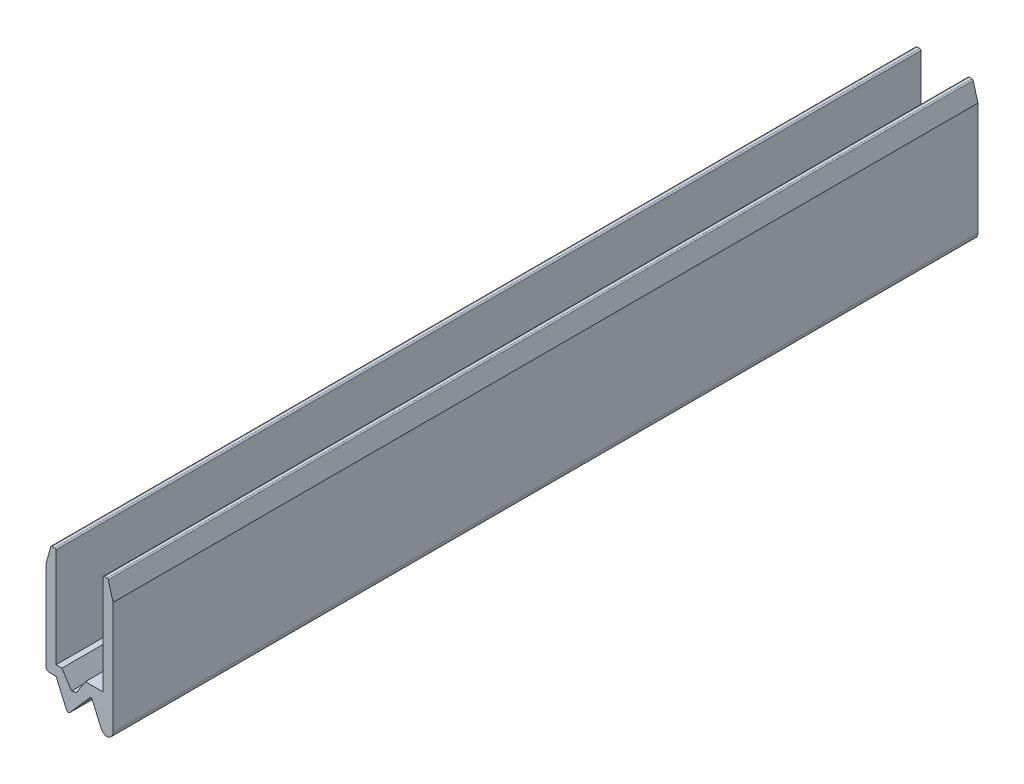
ISO-10303-21;
HEADER;
FILE_DESCRIPTION(('STEP AP214'),'2;1');
FILE_NAME('part.step','',(''),(''),'','','');
FILE_SCHEMA(('AUTOMOTIVE_DESIGN { 1 0 10303 214 1 1 1 1 }'));
ENDSEC;
DATA;
#1=APPLICATION_CONTEXT('core data for automotive mechanical design processes');
#2=APPLICATION_PROTOCOL_DEFINITION('international standard','automotive_design',2000,#1);
#3=PRODUCT_CONTEXT('',#1,'mechanical');
#4=PRODUCT('Part','Part','',(#3));
#5=PRODUCT_RELATED_PRODUCT_CATEGORY('part','',(#4));
#6=PRODUCT_DEFINITION_FORMATION('','',#4);
#7=PRODUCT_DEFINITION_CONTEXT('part definition',#1,'design');
#8=PRODUCT_DEFINITION('design','',#6,#7);
#9=PRODUCT_DEFINITION_SHAPE('','',#8);
#10=(LENGTH_UNIT() NAMED_UNIT(*) SI_UNIT(.MILLI.,.METRE.));
#11=(NAMED_UNIT(*) PLANE_ANGLE_UNIT() SI_UNIT($,.RADIAN.));
#12=(NAMED_UNIT(*) SI_UNIT($,.STERADIAN.) SOLID_ANGLE_UNIT());
#13=UNCERTAINTY_MEASURE_WITH_UNIT(LENGTH_MEASURE(1.E-05),#10,'distance_accuracy_value','');
#14=(GEOMETRIC_REPRESENTATION_CONTEXT(3) GLOBAL_UNCERTAINTY_ASSIGNED_CONTEXT((#13)) GLOBAL_UNIT_ASSIGNED_CONTEXT((#10,
#11,#12)) REPRESENTATION_CONTEXT('',''));
#15=CARTESIAN_POINT('',(0.,0.,0.));
#16=DIRECTION('',(0.,0.,1.));
#17=DIRECTION('',(1.,0.,0.));
#18=AXIS2_PLACEMENT_3D('',#15,#16,#17);
#19=CARTESIAN_POINT('',(9.25000000000002,20.5,129.));
#20=DIRECTION('',(-0.963517909629941,-0.267643863786094,0.));
#21=DIRECTION('',(0.267643863786094,-0.963517909629941,0.));
#22=AXIS2_PLACEMENT_3D('',#19,#20,#21);
#23=PLANE('',#22);
#24=DIRECTION('',(-0.267643863786094,0.963517909629941,0.));
#25=VECTOR('',#24,1.);
#26=CARTESIAN_POINT('',(9.25000000000002,20.5,0.));
#27=LINE('',#26,#25);
#28=CARTESIAN_POINT('',(10.,17.8,0.));
#29=VERTEX_POINT('',#28);
#30=CARTESIAN_POINT('',(9.2906864520119,20.3535287727572,0.));
#31=VERTEX_POINT('',#30);
#32=EDGE_CURVE('E295',#29,#31,#27,.T.);
#33=ORIENTED_EDGE('',*,*,#32,.T.);
#34=DIRECTION('',(0.,0.,-1.));
#35=VECTOR('',#34,1.);
#36=CARTESIAN_POINT('',(9.2906864520119,20.3535287727572,129.));
#37=LINE('',#36,#35);
#38=CARTESIAN_POINT('',(9.2906864520119,20.3535287727572,129.));
#39=VERTEX_POINT('',#38);
#40=EDGE_CURVE('E443',#31,#39,#37,.F.);
#41=ORIENTED_EDGE('',*,*,#40,.T.);
#42=DIRECTION('',(-0.267643863786094,0.963517909629941,0.));
#43=VECTOR('',#42,1.);
#44=CARTESIAN_POINT('',(9.25000000000002,20.5,129.));
#45=LINE('',#44,#43);
#46=CARTESIAN_POINT('',(10.,17.8,129.));
#47=VERTEX_POINT('',#46);
#48=EDGE_CURVE('E351',#47,#39,#45,.T.);
#49=ORIENTED_EDGE('',*,*,#48,.F.);
#50=DIRECTION('',(0.,0.,-1.));
#51=VECTOR('',#50,1.);
#52=CARTESIAN_POINT('',(10.,17.8,129.));
#53=LINE('',#52,#51);
#54=EDGE_CURVE('E294',#47,#29,#53,.T.);
#55=ORIENTED_EDGE('',*,*,#54,.T.);
#56=EDGE_LOOP('',(#33,#41,#49,#55));
#57=FACE_BOUND('',#56,.T.);
#58=ADVANCED_FACE('F46',(#57),#23,.F.);
#59=CARTESIAN_POINT('',(8.5,20.5,129.));
#60=DIRECTION('',(0.,-1.,0.));
#61=DIRECTION('',(1.,0.,0.));
#62=AXIS2_PLACEMENT_3D('',#59,#60,#61);
#63=PLANE('',#62);
#64=DIRECTION('',(-1.,0.,0.));
#65=VECTOR('',#64,1.);
#66=CARTESIAN_POINT('',(8.5,20.5,0.));
#67=LINE('',#66,#65);
#68=CARTESIAN_POINT('',(9.09798287008592,20.5,0.));
#69=VERTEX_POINT('',#68);
#70=CARTESIAN_POINT('',(8.7,20.5,0.));
#71=VERTEX_POINT('',#70);
#72=EDGE_CURVE('E299',#69,#71,#67,.T.);
#73=ORIENTED_EDGE('',*,*,#72,.T.);
#74=DIRECTION('',(0.,0.,-1.));
#75=VECTOR('',#74,1.);
#76=CARTESIAN_POINT('',(8.7,20.5,129.));
#77=LINE('',#76,#75);
#78=CARTESIAN_POINT('',(8.7,20.5,129.));
#79=VERTEX_POINT('',#78);
#80=EDGE_CURVE('E440',#71,#79,#77,.F.);
#81=ORIENTED_EDGE('',*,*,#80,.T.);
#82=DIRECTION('',(-1.,0.,0.));
#83=VECTOR('',#82,1.);
#84=CARTESIAN_POINT('',(8.5,20.5,129.));
#85=LINE('',#84,#83);
#86=CARTESIAN_POINT('',(9.09798287008592,20.5,129.));
#87=VERTEX_POINT('',#86);
#88=EDGE_CURVE('E234',#87,#79,#85,.T.);
#89=ORIENTED_EDGE('',*,*,#88,.F.);
#90=DIRECTION('',(0.,0.,-1.));
#91=VECTOR('',#90,1.);
#92=CARTESIAN_POINT('',(9.09798287008592,20.5,129.));
#93=LINE('',#92,#91);
#94=EDGE_CURVE('E436',#87,#69,#93,.T.);
#95=ORIENTED_EDGE('',*,*,#94,.T.);
#96=EDGE_LOOP('',(#73,#81,#89,#95));
#97=FACE_BOUND('',#96,.T.);
#98=ADVANCED_FACE('F597',(#97),#63,.F.);
#99=CARTESIAN_POINT('',(8.5,5.5,129.));
#100=DIRECTION('',(1.,0.,0.));
#101=DIRECTION('',(0.,0.,-1.));
#102=AXIS2_PLACEMENT_3D('',#99,#100,#101);
#103=PLANE('',#102);
#104=DIRECTION('',(0.,-1.,0.));
#105=VECTOR('',#104,1.);
#106=CARTESIAN_POINT('',(8.5,5.5,129.));
#107=LINE('',#106,#105);
#108=CARTESIAN_POINT('',(8.5,20.3,129.));
#109=VERTEX_POINT('',#108);
#110=CARTESIAN_POINT('',(8.5,5.5,129.));
#111=VERTEX_POINT('',#110);
#112=EDGE_CURVE('E220',#109,#111,#107,.T.);
#113=ORIENTED_EDGE('',*,*,#112,.F.);
#114=DIRECTION('',(0.,0.,-1.));
#115=VECTOR('',#114,1.);
#116=CARTESIAN_POINT('',(8.5,20.3,129.));
#117=LINE('',#116,#115);
#118=CARTESIAN_POINT('',(8.5,20.3,0.));
#119=VERTEX_POINT('',#118);
#120=EDGE_CURVE('E433',#109,#119,#117,.T.);
#121=ORIENTED_EDGE('',*,*,#120,.T.);
#122=DIRECTION('',(0.,-1.,0.));
#123=VECTOR('',#122,1.);
#124=CARTESIAN_POINT('',(8.5,5.5,0.));
#125=LINE('',#124,#123);
#126=CARTESIAN_POINT('',(8.5,5.5,0.));
#127=VERTEX_POINT('',#126);
#128=EDGE_CURVE('E240',#119,#127,#125,.T.);
#129=ORIENTED_EDGE('',*,*,#128,.T.);
#130=DIRECTION('',(0.,0.,-1.));
#131=VECTOR('',#130,1.);
#132=CARTESIAN_POINT('',(8.5,5.5,129.));
#133=LINE('',#132,#131);
#134=EDGE_CURVE('E237',#111,#127,#133,.T.);
#135=ORIENTED_EDGE('',*,*,#134,.F.);
#136=EDGE_LOOP('',(#113,#121,#129,#135));
#137=FACE_BOUND('',#136,.T.);
#138=ADVANCED_FACE('F238',(#137),#103,.F.);
#139=CARTESIAN_POINT('',(5.875,5.5,129.));
#140=DIRECTION('',(0.,-1.,0.));
#141=DIRECTION('',(0.,0.,-1.));
#142=AXIS2_PLACEMENT_3D('',#139,#140,#141);
#143=PLANE('',#142);
#144=DIRECTION('',(-1.,0.,0.));
#145=VECTOR('',#144,1.);
#146=CARTESIAN_POINT('',(5.875,5.5,0.));
#147=LINE('',#146,#145);
#148=CARTESIAN_POINT('',(5.875,5.5,0.));
#149=VERTEX_POINT('',#148);
#150=EDGE_CURVE('E306',#127,#149,#147,.T.);
#151=ORIENTED_EDGE('',*,*,#150,.T.);
#152=DIRECTION('',(0.,0.,-1.));
#153=VECTOR('',#152,1.);
#154=CARTESIAN_POINT('',(5.875,5.5,129.));
#155=LINE('',#154,#153);
#156=CARTESIAN_POINT('',(5.875,5.5,129.));
#157=VERTEX_POINT('',#156);
#158=EDGE_CURVE('E245',#157,#149,#155,.T.);
#159=ORIENTED_EDGE('',*,*,#158,.F.);
#160=DIRECTION('',(-1.,0.,0.));
#161=VECTOR('',#160,1.);
#162=CARTESIAN_POINT('',(5.875,5.5,129.));
#163=LINE('',#162,#161);
#164=EDGE_CURVE('E225',#111,#157,#163,.T.);
#165=ORIENTED_EDGE('',*,*,#164,.F.);
#166=ORIENTED_EDGE('',*,*,#134,.T.);
#167=EDGE_LOOP('',(#151,#159,#165,#166));
#168=FACE_BOUND('',#167,.T.);
#169=ADVANCED_FACE('F247',(#168),#143,.F.);
#170=CARTESIAN_POINT('',(5.875,5.5,129.));
#171=DIRECTION('',(0.843661487732107,-0.53687549219316,0.));
#172=DIRECTION('',(0.53687549219316,0.843661487732107,0.));
#173=AXIS2_PLACEMENT_3D('',#170,#171,#172);
#174=PLANE('',#173);
#175=DIRECTION('',(-0.53687549219316,-0.843661487732107,0.));
#176=VECTOR('',#175,1.);
#177=CARTESIAN_POINT('',(5.875,5.5,0.));
#178=LINE('',#177,#176);
#179=CARTESIAN_POINT('',(4.55450039375452,3.42492919018568,0.));
#180=VERTEX_POINT('',#179);
#181=EDGE_CURVE('E309',#149,#180,#178,.T.);
#182=ORIENTED_EDGE('',*,*,#181,.T.);
#183=DIRECTION('',(0.,0.,1.));
#184=VECTOR('',#183,1.);
#185=CARTESIAN_POINT('',(4.55450039375452,3.42492919018568,129.));
#186=LINE('',#185,#184);
#187=CARTESIAN_POINT('',(4.55450039375452,3.42492919018568,129.));
#188=VERTEX_POINT('',#187);
#189=EDGE_CURVE('E63',#180,#188,#186,.T.);
#190=ORIENTED_EDGE('',*,*,#189,.T.);
#191=DIRECTION('',(-0.53687549219316,-0.843661487732107,0.));
#192=VECTOR('',#191,1.);
#193=CARTESIAN_POINT('',(5.875,5.5,129.));
#194=LINE('',#193,#192);
#195=EDGE_CURVE('E250',#157,#188,#194,.T.);
#196=ORIENTED_EDGE('',*,*,#195,.F.);
#197=ORIENTED_EDGE('',*,*,#158,.T.);
#198=EDGE_LOOP('',(#182,#190,#196,#197));
#199=FACE_BOUND('',#198,.T.);
#200=ADVANCED_FACE('F591',(#199),#174,.F.);
#201=CARTESIAN_POINT('',(4.125,2.75,129.));
#202=DIRECTION('',(-0.843661487732108,-0.536875492193159,0.));
#203=DIRECTION('',(0.536875492193159,-0.843661487732108,0.));
#204=AXIS2_PLACEMENT_3D('',#201,#202,#203);
#205=PLANE('',#204);
#206=DIRECTION('',(-0.536875492193159,0.843661487732107,0.));
#207=VECTOR('',#206,1.);
#208=CARTESIAN_POINT('',(4.125,2.75,129.));
#209=LINE('',#208,#207);
#210=CARTESIAN_POINT('',(3.80192448257403,3.25769009881224,129.));
#211=VERTEX_POINT('',#210);
#212=CARTESIAN_POINT('',(2.375,5.5,129.));
#213=VERTEX_POINT('',#212);
#214=EDGE_CURVE('E253',#211,#213,#209,.T.);
#215=ORIENTED_EDGE('',*,*,#214,.F.);
#216=DIRECTION('',(0.,0.,-1.));
#217=VECTOR('',#216,1.);
#218=CARTESIAN_POINT('',(3.80192448257403,3.25769009881224,0.));
#219=LINE('',#218,#217);
#220=CARTESIAN_POINT('',(3.80192448257403,3.25769009881224,0.));
#221=VERTEX_POINT('',#220);
#222=EDGE_CURVE('E480',#211,#221,#219,.T.);
#223=ORIENTED_EDGE('',*,*,#222,.T.);
#224=DIRECTION('',(-0.536875492193159,0.843661487732107,0.));
#225=VECTOR('',#224,1.);
#226=CARTESIAN_POINT('',(4.125,2.75,0.));
#227=LINE('',#226,#225);
#228=CARTESIAN_POINT('',(2.375,5.5,0.));
#229=VERTEX_POINT('',#228);
#230=EDGE_CURVE('E312',#221,#229,#227,.T.);
#231=ORIENTED_EDGE('',*,*,#230,.T.);
#232=DIRECTION('',(0.,0.,-1.));
#233=VECTOR('',#232,1.);
#234=CARTESIAN_POINT('',(2.375,5.5,129.));
#235=LINE('',#234,#233);
#236=EDGE_CURVE('E367',#213,#229,#235,.T.);
#237=ORIENTED_EDGE('',*,*,#236,.F.);
#238=EDGE_LOOP('',(#215,#223,#231,#237));
#239=FACE_BOUND('',#238,.T.);
#240=ADVANCED_FACE('F492',(#239),#205,.F.);
#241=CARTESIAN_POINT('',(1.5,5.5,129.));
#242=DIRECTION('',(0.,-1.,0.));
#243=DIRECTION('',(1.,0.,0.));
#244=AXIS2_PLACEMENT_3D('',#241,#242,#243);
#245=PLANE('',#244);
#246=DIRECTION('',(-1.,0.,0.));
#247=VECTOR('',#246,1.);
#248=CARTESIAN_POINT('',(1.5,5.5,0.));
#249=LINE('',#248,#247);
#250=CARTESIAN_POINT('',(1.5,5.5,0.));
#251=VERTEX_POINT('',#250);
#252=EDGE_CURVE('E315',#229,#251,#249,.T.);
#253=ORIENTED_EDGE('',*,*,#252,.T.);
#254=DIRECTION('',(0.,0.,-1.));
#255=VECTOR('',#254,1.);
#256=CARTESIAN_POINT('',(1.5,5.5,129.));
#257=LINE('',#256,#255);
#258=CARTESIAN_POINT('',(1.5,5.5,129.));
#259=VERTEX_POINT('',#258);
#260=EDGE_CURVE('E363',#259,#251,#257,.T.);
#261=ORIENTED_EDGE('',*,*,#260,.F.);
#262=DIRECTION('',(-1.,0.,0.));
#263=VECTOR('',#262,1.);
#264=CARTESIAN_POINT('',(1.5,5.5,129.));
#265=LINE('',#264,#263);
#266=EDGE_CURVE('E259',#213,#259,#265,.T.);
#267=ORIENTED_EDGE('',*,*,#266,.F.);
#268=ORIENTED_EDGE('',*,*,#236,.T.);
#269=EDGE_LOOP('',(#253,#261,#267,#268));
#270=FACE_BOUND('',#269,.T.);
#271=ADVANCED_FACE('F502',(#270),#245,.F.);
#272=CARTESIAN_POINT('',(1.5,20.5,129.));
#273=DIRECTION('',(-1.,0.,0.));
#274=DIRECTION('',(0.,-1.,0.));
#275=AXIS2_PLACEMENT_3D('',#272,#273,#274);
#276=PLANE('',#275);
#277=DIRECTION('',(0.,1.,0.));
#278=VECTOR('',#277,1.);
#279=CARTESIAN_POINT('',(1.5,20.5,0.));
#280=LINE('',#279,#278);
#281=CARTESIAN_POINT('',(1.5,20.3,0.));
#282=VERTEX_POINT('',#281);
#283=EDGE_CURVE('E318',#251,#282,#280,.T.);
#284=ORIENTED_EDGE('',*,*,#283,.T.);
#285=DIRECTION('',(0.,0.,-1.));
#286=VECTOR('',#285,1.);
#287=CARTESIAN_POINT('',(1.5,20.3,129.));
#288=LINE('',#287,#286);
#289=CARTESIAN_POINT('',(1.5,20.3,129.));
#290=VERTEX_POINT('',#289);
#291=EDGE_CURVE('E430',#282,#290,#288,.F.);
#292=ORIENTED_EDGE('',*,*,#291,.T.);
#293=DIRECTION('',(0.,1.,0.));
#294=VECTOR('',#293,1.);
#295=CARTESIAN_POINT('',(1.5,20.5,129.));
#296=LINE('',#295,#294);
#297=EDGE_CURVE('E262',#259,#290,#296,.T.);
#298=ORIENTED_EDGE('',*,*,#297,.F.);
#299=ORIENTED_EDGE('',*,*,#260,.T.);
#300=EDGE_LOOP('',(#284,#292,#298,#299));
#301=FACE_BOUND('',#300,.T.);
#302=ADVANCED_FACE('F506',(#301),#276,.F.);
#303=CARTESIAN_POINT('',(0.75,20.5,129.));
#304=DIRECTION('',(0.,-1.,0.));
#305=DIRECTION('',(0.,0.,-1.));
#306=AXIS2_PLACEMENT_3D('',#303,#304,#305);
#307=PLANE('',#306);
#308=DIRECTION('',(-1.,0.,0.));
#309=VECTOR('',#308,1.);
#310=CARTESIAN_POINT('',(0.75,20.5,0.));
#311=LINE('',#310,#309);
#312=CARTESIAN_POINT('',(1.3,20.5,0.));
#313=VERTEX_POINT('',#312);
#314=CARTESIAN_POINT('',(0.902017129914105,20.5,0.));
#315=VERTEX_POINT('',#314);
#316=EDGE_CURVE('E322',#313,#315,#311,.T.);
#317=ORIENTED_EDGE('',*,*,#316,.T.);
#318=DIRECTION('',(0.,0.,-1.));
#319=VECTOR('',#318,1.);
#320=CARTESIAN_POINT('',(0.902017129914105,20.5,129.));
#321=LINE('',#320,#319);
#322=CARTESIAN_POINT('',(0.902017129914105,20.5,129.));
#323=VERTEX_POINT('',#322);
#324=EDGE_CURVE('E404',#315,#323,#321,.F.);
#325=ORIENTED_EDGE('',*,*,#324,.T.);
#326=DIRECTION('',(-1.,0.,0.));
#327=VECTOR('',#326,1.);
#328=CARTESIAN_POINT('',(0.75,20.5,129.));
#329=LINE('',#328,#327);
#330=CARTESIAN_POINT('',(1.3,20.5,129.));
#331=VERTEX_POINT('',#330);
#332=EDGE_CURVE('E266',#331,#323,#329,.T.);
#333=ORIENTED_EDGE('',*,*,#332,.F.);
#334=DIRECTION('',(0.,0.,-1.));
#335=VECTOR('',#334,1.);
#336=CARTESIAN_POINT('',(1.3,20.5,129.));
#337=LINE('',#336,#335);
#338=EDGE_CURVE('E400',#331,#313,#337,.T.);
#339=ORIENTED_EDGE('',*,*,#338,.T.);
#340=EDGE_LOOP('',(#317,#325,#333,#339));
#341=FACE_BOUND('',#340,.T.);
#342=ADVANCED_FACE('F515',(#341),#307,.F.);
#343=CARTESIAN_POINT('',(0.75,20.5,129.));
#344=DIRECTION('',(0.963517909629941,-0.267643863786095,0.));
#345=DIRECTION('',(0.267643863786095,0.963517909629941,0.));
#346=AXIS2_PLACEMENT_3D('',#343,#344,#345);
#347=PLANE('',#346);
#348=DIRECTION('',(-0.267643863786095,-0.963517909629941,0.));
#349=VECTOR('',#348,1.);
#350=CARTESIAN_POINT('',(0.75,20.5,129.));
#351=LINE('',#350,#349);
#352=CARTESIAN_POINT('',(0.709313547988117,20.3535287727572,129.));
#353=VERTEX_POINT('',#352);
#354=CARTESIAN_POINT('',(0.,17.8,129.));
#355=VERTEX_POINT('',#354);
#356=EDGE_CURVE('E269',#353,#355,#351,.T.);
#357=ORIENTED_EDGE('',*,*,#356,.F.);
#358=DIRECTION('',(0.,0.,-1.));
#359=VECTOR('',#358,1.);
#360=CARTESIAN_POINT('',(0.709313547988117,20.3535287727572,129.));
#361=LINE('',#360,#359);
#362=CARTESIAN_POINT('',(0.709313547988117,20.3535287727572,0.));
#363=VERTEX_POINT('',#362);
#364=EDGE_CURVE('E244',#353,#363,#361,.T.);
#365=ORIENTED_EDGE('',*,*,#364,.T.);
#366=DIRECTION('',(-0.267643863786095,-0.963517909629941,0.));
#367=VECTOR('',#366,1.);
#368=CARTESIAN_POINT('',(0.75,20.5,0.));
#369=LINE('',#368,#367);
#370=CARTESIAN_POINT('',(0.,17.8,0.));
#371=VERTEX_POINT('',#370);
#372=EDGE_CURVE('E326',#363,#371,#369,.T.);
#373=ORIENTED_EDGE('',*,*,#372,.T.);
#374=DIRECTION('',(0.,0.,-1.));
#375=VECTOR('',#374,1.);
#376=CARTESIAN_POINT('',(0.,17.8,129.));
#377=LINE('',#376,#375);
#378=EDGE_CURVE('E359',#355,#371,#377,.T.);
#379=ORIENTED_EDGE('',*,*,#378,.F.);
#380=EDGE_LOOP('',(#357,#365,#373,#379));
#381=FACE_BOUND('',#380,.T.);
#382=ADVANCED_FACE('F524',(#381),#347,.F.);
#383=CARTESIAN_POINT('',(0.,4.,129.));
#384=DIRECTION('',(1.,0.,0.));
#385=DIRECTION('',(0.,0.,-1.));
#386=AXIS2_PLACEMENT_3D('',#383,#384,#385);
#387=PLANE('',#386);
#388=DIRECTION('',(0.,-1.,0.));
#389=VECTOR('',#388,1.);
#390=CARTESIAN_POINT('',(0.,4.,0.));
#391=LINE('',#390,#389);
#392=CARTESIAN_POINT('',(0.,4.5,0.));
#393=VERTEX_POINT('',#392);
#394=EDGE_CURVE('E329',#371,#393,#391,.T.);
#395=ORIENTED_EDGE('',*,*,#394,.T.);
#396=DIRECTION('',(0.,0.,-1.));
#397=VECTOR('',#396,1.);
#398=CARTESIAN_POINT('',(0.,4.5,129.));
#399=LINE('',#398,#397);
#400=CARTESIAN_POINT('',(0.,4.5,129.));
#401=VERTEX_POINT('',#400);
#402=EDGE_CURVE('E464',#393,#401,#399,.F.);
#403=ORIENTED_EDGE('',*,*,#402,.T.);
#404=DIRECTION('',(0.,-1.,0.));
#405=VECTOR('',#404,1.);
#406=CARTESIAN_POINT('',(0.,4.,129.));
#407=LINE('',#406,#405);
#408=EDGE_CURVE('E272',#355,#401,#407,.T.);
#409=ORIENTED_EDGE('',*,*,#408,.F.);
#410=ORIENTED_EDGE('',*,*,#378,.T.);
#411=EDGE_LOOP('',(#395,#403,#409,#410));
#412=FACE_BOUND('',#411,.T.);
#413=ADVANCED_FACE('F768',(#412),#387,.F.);
#414=CARTESIAN_POINT('',(1.5,4.,129.));
#415=DIRECTION('',(0.,1.,0.));
#416=DIRECTION('',(0.,0.,1.));
#417=AXIS2_PLACEMENT_3D('',#414,#415,#416);
#418=PLANE('',#417);
#419=DIRECTION('',(1.,0.,0.));
#420=VECTOR('',#419,1.);
#421=CARTESIAN_POINT('',(1.5,4.,129.));
#422=LINE('',#421,#420);
#423=CARTESIAN_POINT('',(0.5,4.,129.));
#424=VERTEX_POINT('',#423);
#425=CARTESIAN_POINT('',(1.5,4.,129.));
#426=VERTEX_POINT('',#425);
#427=EDGE_CURVE('E276',#424,#426,#422,.T.);
#428=ORIENTED_EDGE('',*,*,#427,.F.);
#429=DIRECTION('',(0.,0.,-1.));
#430=VECTOR('',#429,1.);
#431=CARTESIAN_POINT('',(0.5,4.,129.));
#432=LINE('',#431,#430);
#433=CARTESIAN_POINT('',(0.5,4.,0.));
#434=VERTEX_POINT('',#433);
#435=EDGE_CURVE('E460',#424,#434,#432,.T.);
#436=ORIENTED_EDGE('',*,*,#435,.T.);
#437=DIRECTION('',(1.,0.,0.));
#438=VECTOR('',#437,1.);
#439=CARTESIAN_POINT('',(1.5,4.,0.));
#440=LINE('',#439,#438);
#441=CARTESIAN_POINT('',(1.5,4.,0.));
#442=VERTEX_POINT('',#441);
#443=EDGE_CURVE('E333',#434,#442,#440,.T.);
#444=ORIENTED_EDGE('',*,*,#443,.T.);
#445=DIRECTION('',(0.,0.,-1.));
#446=VECTOR('',#445,1.);
#447=CARTESIAN_POINT('',(1.5,4.,129.));
#448=LINE('',#447,#446);
#449=EDGE_CURVE('E355',#426,#442,#448,.T.);
#450=ORIENTED_EDGE('',*,*,#449,.F.);
#451=EDGE_LOOP('',(#428,#436,#444,#450));
#452=FACE_BOUND('',#451,.T.);
#453=ADVANCED_FACE('F536',(#452),#418,.F.);
#454=CARTESIAN_POINT('',(3.25,0.,129.));
#455=DIRECTION('',(0.916157334902189,0.400818834019708,0.));
#456=DIRECTION('',(-0.400818834019708,0.916157334902189,0.));
#457=AXIS2_PLACEMENT_3D('',#454,#455,#456);
#458=PLANE('',#457);
#459=DIRECTION('',(0.400818834019708,-0.916157334902189,0.));
#460=VECTOR('',#459,1.);
#461=CARTESIAN_POINT('',(3.25,0.,0.));
#462=LINE('',#461,#460);
#463=CARTESIAN_POINT('',(3.06057909182733,0.432962075823262,0.));
#464=VERTEX_POINT('',#463);
#465=EDGE_CURVE('E336',#442,#464,#462,.T.);
#466=ORIENTED_EDGE('',*,*,#465,.T.);
#467=DIRECTION('',(0.,0.,-1.));
#468=VECTOR('',#467,1.);
#469=CARTESIAN_POINT('',(3.06057909182733,0.432962075823262,129.));
#470=LINE('',#469,#468);
#471=CARTESIAN_POINT('',(3.06057909182733,0.432962075823262,129.));
#472=VERTEX_POINT('',#471);
#473=EDGE_CURVE('E471',#464,#472,#470,.F.);
#474=ORIENTED_EDGE('',*,*,#473,.T.);
#475=DIRECTION('',(0.400818834019708,-0.916157334902189,0.));
#476=VECTOR('',#475,1.);
#477=CARTESIAN_POINT('',(3.25,0.,129.));
#478=LINE('',#477,#476);
#479=EDGE_CURVE('E279',#426,#472,#478,.T.);
#480=ORIENTED_EDGE('',*,*,#479,.F.);
#481=ORIENTED_EDGE('',*,*,#449,.T.);
#482=EDGE_LOOP('',(#466,#474,#480,#481));
#483=FACE_BOUND('',#482,.T.);
#484=ADVANCED_FACE('F542',(#483),#458,.F.);
#485=CARTESIAN_POINT('',(6.75,4.,129.));
#486=DIRECTION('',(-0.752576694706878,0.658504607868518,0.));
#487=DIRECTION('',(-0.658504607868518,-0.752576694706878,0.));
#488=AXIS2_PLACEMENT_3D('',#485,#486,#487);
#489=PLANE('',#488);
#490=DIRECTION('',(0.658504607868518,0.752576694706878,0.));
#491=VECTOR('',#490,1.);
#492=CARTESIAN_POINT('',(6.75,4.,0.));
#493=LINE('',#492,#491);
#494=CARTESIAN_POINT('',(3.56119930071005,0.355656343668621,0.));
#495=VERTEX_POINT('',#494);
#496=CARTESIAN_POINT('',(6.54253379952664,3.76289577088759,0.));
#497=VERTEX_POINT('',#496);
#498=EDGE_CURVE('E340',#495,#497,#493,.T.);
#499=ORIENTED_EDGE('',*,*,#498,.T.);
#500=DIRECTION('',(0.,0.,-1.));
#501=VECTOR('',#500,1.);
#502=CARTESIAN_POINT('',(6.54253379952664,3.76289577088759,129.));
#503=LINE('',#502,#501);
#504=CARTESIAN_POINT('',(6.54253379952664,3.76289577088759,129.));
#505=VERTEX_POINT('',#504);
#506=EDGE_CURVE('E457',#497,#505,#503,.F.);
#507=ORIENTED_EDGE('',*,*,#506,.T.);
#508=DIRECTION('',(0.658504607868518,0.752576694706878,0.));
#509=VECTOR('',#508,1.);
#510=CARTESIAN_POINT('',(6.75,4.,129.));
#511=LINE('',#510,#509);
#512=CARTESIAN_POINT('',(3.56119930071005,0.355656343668621,129.));
#513=VERTEX_POINT('',#512);
#514=EDGE_CURVE('E283',#513,#505,#511,.T.);
#515=ORIENTED_EDGE('',*,*,#514,.F.);
#516=DIRECTION('',(0.,0.,-1.));
#517=VECTOR('',#516,1.);
#518=CARTESIAN_POINT('',(3.56119930071004,0.355656343668618,129.));
#519=LINE('',#518,#517);
#520=EDGE_CURVE('E453',#513,#495,#519,.T.);
#521=ORIENTED_EDGE('',*,*,#520,.T.);
#522=EDGE_LOOP('',(#499,#507,#515,#521));
#523=FACE_BOUND('',#522,.T.);
#524=ADVANCED_FACE('F551',(#523),#489,.F.);
#525=CARTESIAN_POINT('',(8.5,0.,129.));
#526=DIRECTION('',(0.916157334902189,0.400818834019708,0.));
#527=DIRECTION('',(-0.400818834019708,0.916157334902189,0.));
#528=AXIS2_PLACEMENT_3D('',#525,#526,#527);
#529=PLANE('',#528);
#530=DIRECTION('',(0.400818834019708,-0.916157334902189,0.));
#531=VECTOR('',#530,1.);
#532=CARTESIAN_POINT('',(8.5,0.,129.));
#533=LINE('',#532,#531);
#534=CARTESIAN_POINT('',(6.87628060544845,3.71135861611783,129.));
#535=VERTEX_POINT('',#534);
#536=CARTESIAN_POINT('',(8.23785823988362,0.599181165980293,129.));
#537=VERTEX_POINT('',#536);
#538=EDGE_CURVE('E287',#535,#537,#533,.T.);
#539=ORIENTED_EDGE('',*,*,#538,.F.);
#540=DIRECTION('',(0.,0.,-1.));
#541=VECTOR('',#540,1.);
#542=CARTESIAN_POINT('',(6.87628060544845,3.71135861611783,0.));
#543=LINE('',#542,#541);
#544=CARTESIAN_POINT('',(6.87628060544845,3.71135861611783,0.));
#545=VERTEX_POINT('',#544);
#546=EDGE_CURVE('E449',#535,#545,#543,.T.);
#547=ORIENTED_EDGE('',*,*,#546,.T.);
#548=DIRECTION('',(0.400818834019708,-0.916157334902189,0.));
#549=VECTOR('',#548,1.);
#550=CARTESIAN_POINT('',(8.5,0.,0.));
#551=LINE('',#550,#549);
#552=CARTESIAN_POINT('',(8.23785823988362,0.599181165980293,0.));
#553=VERTEX_POINT('',#552);
#554=EDGE_CURVE('E344',#545,#553,#551,.T.);
#555=ORIENTED_EDGE('',*,*,#554,.T.);
#556=DIRECTION('',(0.,0.,-1.));
#557=VECTOR('',#556,1.);
#558=CARTESIAN_POINT('',(8.23785823988362,0.599181165980293,129.));
#559=LINE('',#558,#557);
#560=EDGE_CURVE('E446',#553,#537,#559,.F.);
#561=ORIENTED_EDGE('',*,*,#560,.T.);
#562=EDGE_LOOP('',(#539,#547,#555,#561));
#563=FACE_BOUND('',#562,.T.);
#564=ADVANCED_FACE('F559',(#563),#529,.F.);
#565=CARTESIAN_POINT('',(10.,17.8,129.));
#566=DIRECTION('',(-1.,0.,0.));
#567=DIRECTION('',(0.,-1.,0.));
#568=AXIS2_PLACEMENT_3D('',#565,#566,#567);
#569=PLANE('',#568);
#570=DIRECTION('',(0.,1.,0.));
#571=VECTOR('',#570,1.);
#572=CARTESIAN_POINT('',(10.,17.8,129.));
#573=LINE('',#572,#571);
#574=CARTESIAN_POINT('',(10.,1.,129.));
#575=VERTEX_POINT('',#574);
#576=EDGE_CURVE('E291',#575,#47,#573,.T.);
#577=ORIENTED_EDGE('',*,*,#576,.F.);
#578=DIRECTION('',(0.,0.,-1.));
#579=VECTOR('',#578,1.);
#580=CARTESIAN_POINT('',(10.,1.,129.));
#581=LINE('',#580,#579);
#582=CARTESIAN_POINT('',(10.,1.,0.));
#583=VERTEX_POINT('',#582);
#584=EDGE_CURVE('E467',#575,#583,#581,.T.);
#585=ORIENTED_EDGE('',*,*,#584,.T.);
#586=DIRECTION('',(0.,1.,0.));
#587=VECTOR('',#586,1.);
#588=CARTESIAN_POINT('',(10.,17.8,0.));
#589=LINE('',#588,#587);
#590=EDGE_CURVE('E348',#583,#29,#589,.T.);
#591=ORIENTED_EDGE('',*,*,#590,.T.);
#592=ORIENTED_EDGE('',*,*,#54,.F.);
#593=EDGE_LOOP('',(#577,#585,#591,#592));
#594=FACE_BOUND('',#593,.T.);
#595=ADVANCED_FACE('F573',(#594),#569,.F.);
#596=CARTESIAN_POINT('',(0.,0.,129.));
#597=DIRECTION('',(0.,0.,-1.));
#598=DIRECTION('',(-1.,0.,0.));
#599=AXIS2_PLACEMENT_3D('',#596,#597,#598);
#600=PLANE('',#599);
#601=ORIENTED_EDGE('',*,*,#332,.T.);
#602=CARTESIAN_POINT('',(0.902017129914105,20.3,129.));
#603=DIRECTION('',(0.,0.,-1.));
#604=DIRECTION('',(-1.,0.,0.));
#605=AXIS2_PLACEMENT_3D('',#602,#603,#604);
#606=CIRCLE('',#605,0.2);
#607=EDGE_CURVE('E427',#323,#353,#606,.F.);
#608=ORIENTED_EDGE('',*,*,#607,.T.);
#609=ORIENTED_EDGE('',*,*,#356,.T.);
#610=ORIENTED_EDGE('',*,*,#408,.T.);
#611=CARTESIAN_POINT('',(0.5,4.5,129.));
#612=DIRECTION('',(0.,0.,-1.));
#613=DIRECTION('',(-1.,0.,0.));
#614=AXIS2_PLACEMENT_3D('',#611,#612,#613);
#615=CIRCLE('',#614,0.5);
#616=EDGE_CURVE('E416',#401,#424,#615,.F.);
#617=ORIENTED_EDGE('',*,*,#616,.T.);
#618=ORIENTED_EDGE('',*,*,#427,.T.);
#619=ORIENTED_EDGE('',*,*,#479,.T.);
#620=CARTESIAN_POINT('',(3.33542629229798,0.553207726029174,129.));
#621=DIRECTION('',(0.,0.,-1.));
#622=DIRECTION('',(-1.,0.,0.));
#623=AXIS2_PLACEMENT_3D('',#620,#621,#622);
#624=CIRCLE('',#623,0.3);
#625=EDGE_CURVE('E407',#472,#513,#624,.F.);
#626=ORIENTED_EDGE('',*,*,#625,.T.);
#627=ORIENTED_EDGE('',*,*,#514,.T.);
#628=CARTESIAN_POINT('',(6.69304913846802,3.63119484931389,129.));
#629=DIRECTION('',(0.,0.,-1.));
#630=DIRECTION('',(-1.,0.,0.));
#631=AXIS2_PLACEMENT_3D('',#628,#629,#630);
#632=CIRCLE('',#631,0.2);
#633=EDGE_CURVE('E477',#505,#535,#632,.T.);
#634=ORIENTED_EDGE('',*,*,#633,.T.);
#635=ORIENTED_EDGE('',*,*,#538,.T.);
#636=CARTESIAN_POINT('',(9.15401557478581,1.,129.));
#637=DIRECTION('',(0.,0.,-1.));
#638=DIRECTION('',(-1.,0.,0.));
#639=AXIS2_PLACEMENT_3D('',#636,#637,#638);
#640=CIRCLE('',#639,1.);
#641=CARTESIAN_POINT('',(9.0770077873929,0.0029695086503881,129.));
#642=VERTEX_POINT('',#641);
#643=EDGE_CURVE('E410',#537,#642,#640,.F.);
#644=ORIENTED_EDGE('',*,*,#643,.T.);
#645=CARTESIAN_POINT('',(9.,1.,129.));
#646=DIRECTION('',(0.,0.,-1.));
#647=DIRECTION('',(-1.,0.,0.));
#648=AXIS2_PLACEMENT_3D('',#645,#646,#647);
#649=CIRCLE('',#648,1.);
#650=EDGE_CURVE('E413',#642,#575,#649,.F.);
#651=ORIENTED_EDGE('',*,*,#650,.T.);
#652=ORIENTED_EDGE('',*,*,#576,.T.);
#653=ORIENTED_EDGE('',*,*,#48,.T.);
#654=CARTESIAN_POINT('',(9.09798287008591,20.3,129.));
#655=DIRECTION('',(0.,0.,-1.));
#656=DIRECTION('',(-1.,0.,0.));
#657=AXIS2_PLACEMENT_3D('',#654,#655,#656);
#658=CIRCLE('',#657,0.2);
#659=EDGE_CURVE('E419',#39,#87,#658,.F.);
#660=ORIENTED_EDGE('',*,*,#659,.T.);
#661=ORIENTED_EDGE('',*,*,#88,.T.);
#662=CARTESIAN_POINT('',(8.7,20.3,129.));
#663=DIRECTION('',(0.,0.,-1.));
#664=DIRECTION('',(-1.,0.,0.));
#665=AXIS2_PLACEMENT_3D('',#662,#663,#664);
#666=CIRCLE('',#665,0.2);
#667=EDGE_CURVE('E229',#79,#109,#666,.F.);
#668=ORIENTED_EDGE('',*,*,#667,.T.);
#669=ORIENTED_EDGE('',*,*,#112,.T.);
#670=ORIENTED_EDGE('',*,*,#164,.T.);
#671=ORIENTED_EDGE('',*,*,#195,.T.);
#672=DIRECTION('',(0.976187060183954,0.21693045781865,0.));
#673=VECTOR('',#672,1.);
#674=CARTESIAN_POINT('',(-0.510949692333219,2.29927361549955,129.));
#675=LINE('',#674,#673);
#676=EDGE_CURVE('E12',#188,#211,#675,.F.);
#677=ORIENTED_EDGE('',*,*,#676,.T.);
#678=ORIENTED_EDGE('',*,*,#214,.T.);
#679=ORIENTED_EDGE('',*,*,#266,.T.);
#680=ORIENTED_EDGE('',*,*,#297,.T.);
#681=CARTESIAN_POINT('',(1.3,20.3,129.));
#682=DIRECTION('',(0.,0.,-1.));
#683=DIRECTION('',(-1.,0.,0.));
#684=AXIS2_PLACEMENT_3D('',#681,#682,#683);
#685=CIRCLE('',#684,0.2);
#686=EDGE_CURVE('E424',#290,#331,#685,.F.);
#687=ORIENTED_EDGE('',*,*,#686,.T.);
#688=EDGE_LOOP('',(#601,#608,#609,#610,#617,#618,#619,#626,#627,#634,#635,#644,#651,#652,#653,
#660,#661,#668,#669,#670,#671,#677,#678,#679,#680,#687));
#689=FACE_BOUND('',#688,.T.);
#690=ADVANCED_FACE('F223',(#689),#600,.F.);
#691=CARTESIAN_POINT('',(0.,0.,0.));
#692=DIRECTION('',(0.,0.,-1.));
#693=DIRECTION('',(-1.,0.,0.));
#694=AXIS2_PLACEMENT_3D('',#691,#692,#693);
#695=PLANE('',#694);
#696=ORIENTED_EDGE('',*,*,#372,.F.);
#697=CARTESIAN_POINT('',(0.902017129914105,20.3,0.));
#698=DIRECTION('',(0.,0.,-1.));
#699=DIRECTION('',(-1.,0.,0.));
#700=AXIS2_PLACEMENT_3D('',#697,#698,#699);
#701=CIRCLE('',#700,0.2);
#702=EDGE_CURVE('E397',#363,#315,#701,.T.);
#703=ORIENTED_EDGE('',*,*,#702,.T.);
#704=ORIENTED_EDGE('',*,*,#316,.F.);
#705=CARTESIAN_POINT('',(1.3,20.3,0.));
#706=DIRECTION('',(0.,0.,-1.));
#707=DIRECTION('',(-1.,0.,0.));
#708=AXIS2_PLACEMENT_3D('',#705,#706,#707);
#709=CIRCLE('',#708,0.2);
#710=EDGE_CURVE('E394',#313,#282,#709,.T.);
#711=ORIENTED_EDGE('',*,*,#710,.T.);
#712=ORIENTED_EDGE('',*,*,#283,.F.);
#713=ORIENTED_EDGE('',*,*,#252,.F.);
#714=ORIENTED_EDGE('',*,*,#230,.F.);
#715=DIRECTION('',(-0.976187060183954,-0.21693045781865,0.));
#716=VECTOR('',#715,1.);
#717=CARTESIAN_POINT('',(3.80192448257403,3.25769009881224,0.));
#718=LINE('',#717,#716);
#719=EDGE_CURVE('E56',#221,#180,#718,.F.);
#720=ORIENTED_EDGE('',*,*,#719,.T.);
#721=ORIENTED_EDGE('',*,*,#181,.F.);
#722=ORIENTED_EDGE('',*,*,#150,.F.);
#723=ORIENTED_EDGE('',*,*,#128,.F.);
#724=CARTESIAN_POINT('',(8.7,20.3,0.));
#725=DIRECTION('',(0.,0.,-1.));
#726=DIRECTION('',(-1.,0.,0.));
#727=AXIS2_PLACEMENT_3D('',#724,#725,#726);
#728=CIRCLE('',#727,0.2);
#729=EDGE_CURVE('E391',#119,#71,#728,.T.);
#730=ORIENTED_EDGE('',*,*,#729,.T.);
#731=ORIENTED_EDGE('',*,*,#72,.F.);
#732=CARTESIAN_POINT('',(9.09798287008591,20.3,0.));
#733=DIRECTION('',(0.,0.,-1.));
#734=DIRECTION('',(-1.,0.,0.));
#735=AXIS2_PLACEMENT_3D('',#732,#733,#734);
#736=CIRCLE('',#735,0.2);
#737=EDGE_CURVE('E388',#69,#31,#736,.T.);
#738=ORIENTED_EDGE('',*,*,#737,.T.);
#739=ORIENTED_EDGE('',*,*,#32,.F.);
#740=ORIENTED_EDGE('',*,*,#590,.F.);
#741=CARTESIAN_POINT('',(9.,1.,0.));
#742=DIRECTION('',(0.,0.,-1.));
#743=DIRECTION('',(-1.,0.,0.));
#744=AXIS2_PLACEMENT_3D('',#741,#742,#743);
#745=CIRCLE('',#744,1.);
#746=CARTESIAN_POINT('',(9.0770077873929,0.0029695086503881,0.));
#747=VERTEX_POINT('',#746);
#748=EDGE_CURVE('E382',#583,#747,#745,.T.);
#749=ORIENTED_EDGE('',*,*,#748,.T.);
#750=CARTESIAN_POINT('',(9.15401557478581,1.,0.));
#751=DIRECTION('',(0.,0.,-1.));
#752=DIRECTION('',(-1.,0.,0.));
#753=AXIS2_PLACEMENT_3D('',#750,#751,#752);
#754=CIRCLE('',#753,1.);
#755=EDGE_CURVE('E379',#747,#553,#754,.T.);
#756=ORIENTED_EDGE('',*,*,#755,.T.);
#757=ORIENTED_EDGE('',*,*,#554,.F.);
#758=CARTESIAN_POINT('',(6.69304913846802,3.63119484931389,0.));
#759=DIRECTION('',(0.,0.,-1.));
#760=DIRECTION('',(-1.,0.,0.));
#761=AXIS2_PLACEMENT_3D('',#758,#759,#760);
#762=CIRCLE('',#761,0.2);
#763=EDGE_CURVE('E474',#545,#497,#762,.F.);
#764=ORIENTED_EDGE('',*,*,#763,.T.);
#765=ORIENTED_EDGE('',*,*,#498,.F.);
#766=CARTESIAN_POINT('',(3.33542629229798,0.553207726029174,0.));
#767=DIRECTION('',(0.,0.,-1.));
#768=DIRECTION('',(-1.,0.,0.));
#769=AXIS2_PLACEMENT_3D('',#766,#767,#768);
#770=CIRCLE('',#769,0.3);
#771=EDGE_CURVE('E376',#495,#464,#770,.T.);
#772=ORIENTED_EDGE('',*,*,#771,.T.);
#773=ORIENTED_EDGE('',*,*,#465,.F.);
#774=ORIENTED_EDGE('',*,*,#443,.F.);
#775=CARTESIAN_POINT('',(0.5,4.5,0.));
#776=DIRECTION('',(0.,0.,-1.));
#777=DIRECTION('',(-1.,0.,0.));
#778=AXIS2_PLACEMENT_3D('',#775,#776,#777);
#779=CIRCLE('',#778,0.5);
#780=EDGE_CURVE('E385',#434,#393,#779,.T.);
#781=ORIENTED_EDGE('',*,*,#780,.T.);
#782=ORIENTED_EDGE('',*,*,#394,.F.);
#783=EDGE_LOOP('',(#696,#703,#704,#711,#712,#713,#714,#720,#721,#722,#723,#730,#731,#738,#739,
#740,#749,#756,#757,#764,#765,#772,#773,#774,#781,#782));
#784=FACE_BOUND('',#783,.T.);
#785=ADVANCED_FACE('F498',(#784),#695,.T.);
#786=CARTESIAN_POINT('',(0.902017129914105,20.3,129.));
#787=DIRECTION('',(0.,0.,-1.));
#788=DIRECTION('',(-1.,0.,0.));
#789=AXIS2_PLACEMENT_3D('',#786,#787,#788);
#790=CYLINDRICAL_SURFACE('',#789,0.2);
#791=ORIENTED_EDGE('',*,*,#607,.F.);
#792=ORIENTED_EDGE('',*,*,#324,.F.);
#793=ORIENTED_EDGE('',*,*,#702,.F.);
#794=ORIENTED_EDGE('',*,*,#364,.F.);
#795=EDGE_LOOP('',(#791,#792,#793,#794));
#796=FACE_BOUND('',#795,.T.);
#797=ADVANCED_FACE('F521',(#796),#790,.T.);
#798=CARTESIAN_POINT('',(1.3,20.3,129.));
#799=DIRECTION('',(0.,0.,-1.));
#800=DIRECTION('',(-1.,0.,0.));
#801=AXIS2_PLACEMENT_3D('',#798,#799,#800);
#802=CYLINDRICAL_SURFACE('',#801,0.2);
#803=ORIENTED_EDGE('',*,*,#686,.F.);
#804=ORIENTED_EDGE('',*,*,#291,.F.);
#805=ORIENTED_EDGE('',*,*,#710,.F.);
#806=ORIENTED_EDGE('',*,*,#338,.F.);
#807=EDGE_LOOP('',(#803,#804,#805,#806));
#808=FACE_BOUND('',#807,.T.);
#809=ADVANCED_FACE('F512',(#808),#802,.T.);
#810=CARTESIAN_POINT('',(8.7,20.3,129.));
#811=DIRECTION('',(0.,0.,-1.));
#812=DIRECTION('',(-1.,0.,0.));
#813=AXIS2_PLACEMENT_3D('',#810,#811,#812);
#814=CYLINDRICAL_SURFACE('',#813,0.2);
#815=ORIENTED_EDGE('',*,*,#667,.F.);
#816=ORIENTED_EDGE('',*,*,#80,.F.);
#817=ORIENTED_EDGE('',*,*,#729,.F.);
#818=ORIENTED_EDGE('',*,*,#120,.F.);
#819=EDGE_LOOP('',(#815,#816,#817,#818));
#820=FACE_BOUND('',#819,.T.);
#821=ADVANCED_FACE('F589',(#820),#814,.T.);
#822=CARTESIAN_POINT('',(9.09798287008591,20.3,129.));
#823=DIRECTION('',(0.,0.,-1.));
#824=DIRECTION('',(-1.,0.,0.));
#825=AXIS2_PLACEMENT_3D('',#822,#823,#824);
#826=CYLINDRICAL_SURFACE('',#825,0.2);
#827=ORIENTED_EDGE('',*,*,#659,.F.);
#828=ORIENTED_EDGE('',*,*,#40,.F.);
#829=ORIENTED_EDGE('',*,*,#737,.F.);
#830=ORIENTED_EDGE('',*,*,#94,.F.);
#831=EDGE_LOOP('',(#827,#828,#829,#830));
#832=FACE_BOUND('',#831,.T.);
#833=ADVANCED_FACE('F611',(#832),#826,.T.);
#834=CARTESIAN_POINT('',(6.69304913846802,3.63119484931389,129.));
#835=DIRECTION('',(0.,0.,1.));
#836=DIRECTION('',(1.,0.,0.));
#837=AXIS2_PLACEMENT_3D('',#834,#835,#836);
#838=CYLINDRICAL_SURFACE('',#837,0.2);
#839=ORIENTED_EDGE('',*,*,#633,.F.);
#840=ORIENTED_EDGE('',*,*,#506,.F.);
#841=ORIENTED_EDGE('',*,*,#763,.F.);
#842=ORIENTED_EDGE('',*,*,#546,.F.);
#843=EDGE_LOOP('',(#839,#840,#841,#842));
#844=FACE_BOUND('',#843,.T.);
#845=ADVANCED_FACE('F554',(#844),#838,.F.);
#846=CARTESIAN_POINT('',(0.5,4.5,129.));
#847=DIRECTION('',(0.,0.,-1.));
#848=DIRECTION('',(-1.,0.,0.));
#849=AXIS2_PLACEMENT_3D('',#846,#847,#848);
#850=CYLINDRICAL_SURFACE('',#849,0.5);
#851=ORIENTED_EDGE('',*,*,#616,.F.);
#852=ORIENTED_EDGE('',*,*,#402,.F.);
#853=ORIENTED_EDGE('',*,*,#780,.F.);
#854=ORIENTED_EDGE('',*,*,#435,.F.);
#855=EDGE_LOOP('',(#851,#852,#853,#854));
#856=FACE_BOUND('',#855,.T.);
#857=ADVANCED_FACE('F533',(#856),#850,.T.);
#858=CARTESIAN_POINT('',(9.15401557478581,1.,129.));
#859=DIRECTION('',(0.,0.,-1.));
#860=DIRECTION('',(-1.,0.,0.));
#861=AXIS2_PLACEMENT_3D('',#858,#859,#860);
#862=CYLINDRICAL_SURFACE('',#861,1.);
#863=DIRECTION('',(0.,0.,-1.));
#864=VECTOR('',#863,1.);
#865=CARTESIAN_POINT('',(9.0770077873929,0.0029695086503881,64.5));
#866=LINE('',#865,#864);
#867=EDGE_CURVE('E300',#642,#747,#866,.T.);
#868=ORIENTED_EDGE('',*,*,#867,.F.);
#869=ORIENTED_EDGE('',*,*,#643,.F.);
#870=ORIENTED_EDGE('',*,*,#560,.F.);
#871=ORIENTED_EDGE('',*,*,#755,.F.);
#872=EDGE_LOOP('',(#868,#869,#870,#871));
#873=FACE_BOUND('',#872,.T.);
#874=ADVANCED_FACE('F565',(#873),#862,.T.);
#875=CARTESIAN_POINT('',(9.,1.,129.));
#876=DIRECTION('',(0.,0.,-1.));
#877=DIRECTION('',(-1.,0.,0.));
#878=AXIS2_PLACEMENT_3D('',#875,#876,#877);
#879=CYLINDRICAL_SURFACE('',#878,1.);
#880=ORIENTED_EDGE('',*,*,#650,.F.);
#881=ORIENTED_EDGE('',*,*,#867,.T.);
#882=ORIENTED_EDGE('',*,*,#748,.F.);
#883=ORIENTED_EDGE('',*,*,#584,.F.);
#884=EDGE_LOOP('',(#880,#881,#882,#883));
#885=FACE_BOUND('',#884,.T.);
#886=ADVANCED_FACE('F576',(#885),#879,.T.);
#887=CARTESIAN_POINT('',(3.33542629229798,0.553207726029174,129.));
#888=DIRECTION('',(0.,0.,-1.));
#889=DIRECTION('',(-1.,0.,0.));
#890=AXIS2_PLACEMENT_3D('',#887,#888,#889);
#891=CYLINDRICAL_SURFACE('',#890,0.3);
#892=ORIENTED_EDGE('',*,*,#625,.F.);
#893=ORIENTED_EDGE('',*,*,#473,.F.);
#894=ORIENTED_EDGE('',*,*,#771,.F.);
#895=ORIENTED_EDGE('',*,*,#520,.F.);
#896=EDGE_LOOP('',(#892,#893,#894,#895));
#897=FACE_BOUND('',#896,.T.);
#898=ADVANCED_FACE('F546',(#897),#891,.T.);
#899=CARTESIAN_POINT('',(3.80192448257403,3.25769009881224,129.));
#900=DIRECTION('',(-0.21693045781865,0.976187060183954,0.));
#901=DIRECTION('',(0.,0.,1.));
#902=AXIS2_PLACEMENT_3D('',#899,#900,#901);
#903=PLANE('',#902);
#904=ORIENTED_EDGE('',*,*,#676,.F.);
#905=ORIENTED_EDGE('',*,*,#189,.F.);
#906=ORIENTED_EDGE('',*,*,#719,.F.);
#907=ORIENTED_EDGE('',*,*,#222,.F.);
#908=EDGE_LOOP('',(#904,#905,#906,#907));
#909=FACE_BOUND('',#908,.T.);
#910=ADVANCED_FACE('F49',(#909),#903,.T.);
#911=CLOSED_SHELL('',(#58,#98,#138,#169,#200,#240,#271,#302,#342,#382,#413,#453,#484,#524,#564,
#595,#690,#785,#797,#809,#821,#833,#845,#857,#874,#886,#898,#910));
#912=MANIFOLD_SOLID_BREP('B2',#911);
#913=ADVANCED_BREP_SHAPE_REPRESENTATION('',(#18,#912),#14);
#914=SHAPE_DEFINITION_REPRESENTATION(#9,#913);
ENDSEC;
END-ISO-10303-21;
